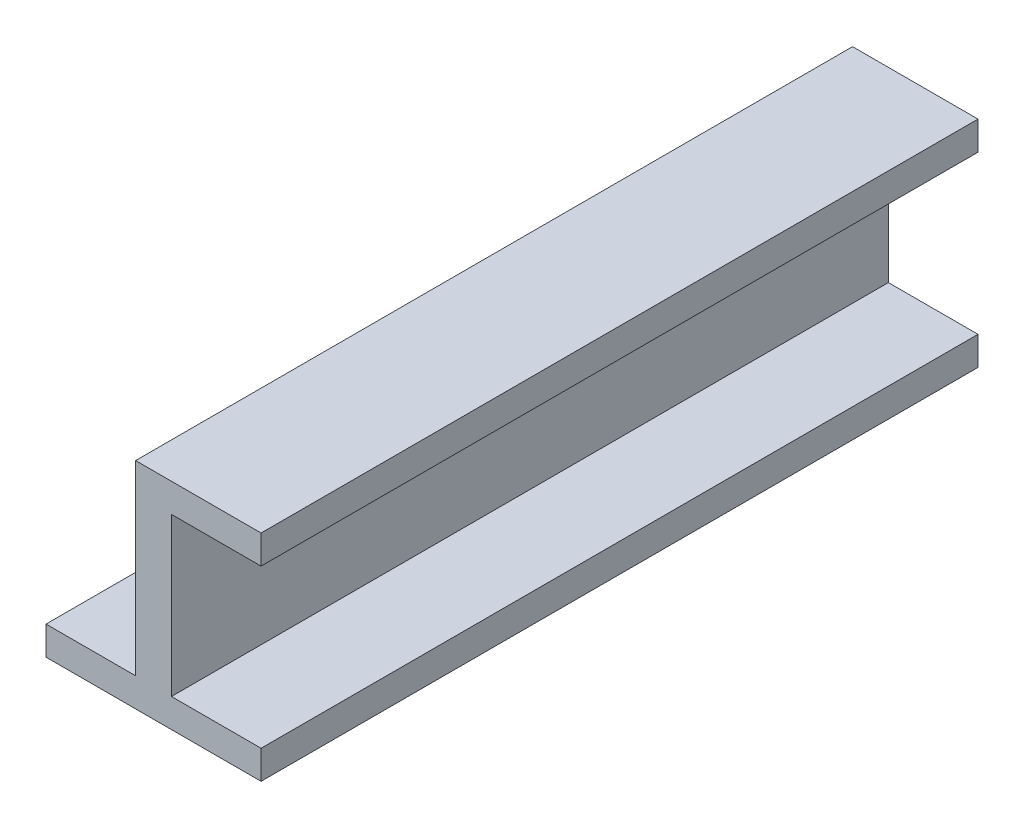
ISO-10303-21;
HEADER;
FILE_DESCRIPTION(('STEP AP214'),'2;1');
FILE_NAME('part.step','',(''),(''),'','','');
FILE_SCHEMA(('AUTOMOTIVE_DESIGN { 1 0 10303 214 1 1 1 1 }'));
ENDSEC;
DATA;
#1=APPLICATION_CONTEXT('core data for automotive mechanical design processes');
#2=APPLICATION_PROTOCOL_DEFINITION('international standard','automotive_design',2000,#1);
#3=PRODUCT_CONTEXT('',#1,'mechanical');
#4=PRODUCT('Part','Part','',(#3));
#5=PRODUCT_RELATED_PRODUCT_CATEGORY('part','',(#4));
#6=PRODUCT_DEFINITION_FORMATION('','',#4);
#7=PRODUCT_DEFINITION_CONTEXT('part definition',#1,'design');
#8=PRODUCT_DEFINITION('design','',#6,#7);
#9=PRODUCT_DEFINITION_SHAPE('','',#8);
#10=(LENGTH_UNIT() NAMED_UNIT(*) SI_UNIT(.MILLI.,.METRE.));
#11=(NAMED_UNIT(*) PLANE_ANGLE_UNIT() SI_UNIT($,.RADIAN.));
#12=(NAMED_UNIT(*) SI_UNIT($,.STERADIAN.) SOLID_ANGLE_UNIT());
#13=UNCERTAINTY_MEASURE_WITH_UNIT(LENGTH_MEASURE(1.E-05),#10,'distance_accuracy_value','');
#14=(GEOMETRIC_REPRESENTATION_CONTEXT(3) GLOBAL_UNCERTAINTY_ASSIGNED_CONTEXT((#13)) GLOBAL_UNIT_ASSIGNED_CONTEXT((#10,
#11,#12)) REPRESENTATION_CONTEXT('',''));
#15=CARTESIAN_POINT('',(0.,0.,0.));
#16=DIRECTION('',(0.,0.,1.));
#17=DIRECTION('',(1.,0.,0.));
#18=AXIS2_PLACEMENT_3D('',#15,#16,#17);
#19=CARTESIAN_POINT('',(-5.,0.,100.));
#20=DIRECTION('',(-1.,0.,0.));
#21=DIRECTION('',(0.,0.,1.));
#22=AXIS2_PLACEMENT_3D('',#19,#20,#21);
#23=PLANE('',#22);
#24=DIRECTION('',(0.,1.,0.));
#25=VECTOR('',#24,1.);
#26=CARTESIAN_POINT('',(-5.,0.,-100.));
#27=LINE('',#26,#25);
#28=CARTESIAN_POINT('',(-5.,-22.,-100.));
#29=VERTEX_POINT('',#28);
#30=CARTESIAN_POINT('',(-5.,30.,-100.));
#31=VERTEX_POINT('',#30);
#32=EDGE_CURVE('E140',#29,#31,#27,.T.);
#33=ORIENTED_EDGE('',*,*,#32,.F.);
#34=DIRECTION('',(0.,0.,-1.));
#35=VECTOR('',#34,1.);
#36=CARTESIAN_POINT('',(-5.,-22.,100.));
#37=LINE('',#36,#35);
#38=CARTESIAN_POINT('',(-5.,-22.,100.));
#39=VERTEX_POINT('',#38);
#40=EDGE_CURVE('E11',#39,#29,#37,.T.);
#41=ORIENTED_EDGE('',*,*,#40,.F.);
#42=DIRECTION('',(0.,1.,0.));
#43=VECTOR('',#42,1.);
#44=CARTESIAN_POINT('',(-5.,0.,100.));
#45=LINE('',#44,#43);
#46=CARTESIAN_POINT('',(-5.,30.,100.));
#47=VERTEX_POINT('',#46);
#48=EDGE_CURVE('E163',#39,#47,#45,.T.);
#49=ORIENTED_EDGE('',*,*,#48,.T.);
#50=DIRECTION('',(0.,0.,-1.));
#51=VECTOR('',#50,1.);
#52=CARTESIAN_POINT('',(-5.,30.,100.));
#53=LINE('',#52,#51);
#54=EDGE_CURVE('E51',#47,#31,#53,.T.);
#55=ORIENTED_EDGE('',*,*,#54,.T.);
#56=EDGE_LOOP('',(#33,#41,#49,#55));
#57=FACE_BOUND('',#56,.T.);
#58=ADVANCED_FACE('F35',(#57),#23,.T.);
#59=CARTESIAN_POINT('',(0.,-22.,100.));
#60=DIRECTION('',(0.,-1.,0.));
#61=DIRECTION('',(1.,0.,0.));
#62=AXIS2_PLACEMENT_3D('',#59,#60,#61);
#63=PLANE('',#62);
#64=DIRECTION('',(-1.,0.,0.));
#65=VECTOR('',#64,1.);
#66=CARTESIAN_POINT('',(0.,-22.,-100.));
#67=LINE('',#66,#65);
#68=CARTESIAN_POINT('',(-30.,-22.,-100.));
#69=VERTEX_POINT('',#68);
#70=EDGE_CURVE('E142',#29,#69,#67,.T.);
#71=ORIENTED_EDGE('',*,*,#70,.T.);
#72=DIRECTION('',(0.,0.,-1.));
#73=VECTOR('',#72,1.);
#74=CARTESIAN_POINT('',(-30.,-22.,100.));
#75=LINE('',#74,#73);
#76=CARTESIAN_POINT('',(-30.,-22.,100.));
#77=VERTEX_POINT('',#76);
#78=EDGE_CURVE('E43',#77,#69,#75,.T.);
#79=ORIENTED_EDGE('',*,*,#78,.F.);
#80=DIRECTION('',(-1.,0.,0.));
#81=VECTOR('',#80,1.);
#82=CARTESIAN_POINT('',(0.,-22.,100.));
#83=LINE('',#82,#81);
#84=EDGE_CURVE('E209',#39,#77,#83,.T.);
#85=ORIENTED_EDGE('',*,*,#84,.F.);
#86=ORIENTED_EDGE('',*,*,#40,.T.);
#87=EDGE_LOOP('',(#71,#79,#85,#86));
#88=FACE_BOUND('',#87,.T.);
#89=ADVANCED_FACE('F186',(#88),#63,.F.);
#90=CARTESIAN_POINT('',(-30.,0.,100.));
#91=DIRECTION('',(-1.,0.,0.));
#92=DIRECTION('',(0.,0.,1.));
#93=AXIS2_PLACEMENT_3D('',#90,#91,#92);
#94=PLANE('',#93);
#95=DIRECTION('',(0.,1.,0.));
#96=VECTOR('',#95,1.);
#97=CARTESIAN_POINT('',(-30.,0.,-100.));
#98=LINE('',#97,#96);
#99=CARTESIAN_POINT('',(-30.,-30.,-100.));
#100=VERTEX_POINT('',#99);
#101=EDGE_CURVE('E145',#100,#69,#98,.T.);
#102=ORIENTED_EDGE('',*,*,#101,.F.);
#103=DIRECTION('',(0.,0.,-1.));
#104=VECTOR('',#103,1.);
#105=CARTESIAN_POINT('',(-30.,-30.,100.));
#106=LINE('',#105,#104);
#107=CARTESIAN_POINT('',(-30.,-30.,100.));
#108=VERTEX_POINT('',#107);
#109=EDGE_CURVE('E176',#108,#100,#106,.T.);
#110=ORIENTED_EDGE('',*,*,#109,.F.);
#111=DIRECTION('',(0.,1.,0.));
#112=VECTOR('',#111,1.);
#113=CARTESIAN_POINT('',(-30.,0.,100.));
#114=LINE('',#113,#112);
#115=EDGE_CURVE('E183',#108,#77,#114,.T.);
#116=ORIENTED_EDGE('',*,*,#115,.T.);
#117=ORIENTED_EDGE('',*,*,#78,.T.);
#118=EDGE_LOOP('',(#102,#110,#116,#117));
#119=FACE_BOUND('',#118,.T.);
#120=ADVANCED_FACE('F181',(#119),#94,.T.);
#121=CARTESIAN_POINT('',(0.,-30.,100.));
#122=DIRECTION('',(0.,1.,0.));
#123=DIRECTION('',(-1.,0.,0.));
#124=AXIS2_PLACEMENT_3D('',#121,#122,#123);
#125=PLANE('',#124);
#126=DIRECTION('',(1.,0.,0.));
#127=VECTOR('',#126,1.);
#128=CARTESIAN_POINT('',(0.,-30.,-100.));
#129=LINE('',#128,#127);
#130=CARTESIAN_POINT('',(30.,-30.,-100.));
#131=VERTEX_POINT('',#130);
#132=EDGE_CURVE('E148',#100,#131,#129,.T.);
#133=ORIENTED_EDGE('',*,*,#132,.T.);
#134=DIRECTION('',(0.,0.,-1.));
#135=VECTOR('',#134,1.);
#136=CARTESIAN_POINT('',(30.,-30.,100.));
#137=LINE('',#136,#135);
#138=CARTESIAN_POINT('',(30.,-30.,100.));
#139=VERTEX_POINT('',#138);
#140=EDGE_CURVE('E173',#139,#131,#137,.T.);
#141=ORIENTED_EDGE('',*,*,#140,.F.);
#142=DIRECTION('',(1.,0.,0.));
#143=VECTOR('',#142,1.);
#144=CARTESIAN_POINT('',(0.,-30.,100.));
#145=LINE('',#144,#143);
#146=EDGE_CURVE('E203',#108,#139,#145,.T.);
#147=ORIENTED_EDGE('',*,*,#146,.F.);
#148=ORIENTED_EDGE('',*,*,#109,.T.);
#149=EDGE_LOOP('',(#133,#141,#147,#148));
#150=FACE_BOUND('',#149,.T.);
#151=ADVANCED_FACE('F194',(#150),#125,.F.);
#152=CARTESIAN_POINT('',(30.,0.,100.));
#153=DIRECTION('',(-1.,0.,0.));
#154=DIRECTION('',(0.,0.,1.));
#155=AXIS2_PLACEMENT_3D('',#152,#153,#154);
#156=PLANE('',#155);
#157=DIRECTION('',(0.,1.,0.));
#158=VECTOR('',#157,1.);
#159=CARTESIAN_POINT('',(30.,0.,-100.));
#160=LINE('',#159,#158);
#161=CARTESIAN_POINT('',(30.,-22.,-100.));
#162=VERTEX_POINT('',#161);
#163=EDGE_CURVE('E150',#131,#162,#160,.T.);
#164=ORIENTED_EDGE('',*,*,#163,.T.);
#165=DIRECTION('',(0.,0.,-1.));
#166=VECTOR('',#165,1.);
#167=CARTESIAN_POINT('',(30.,-22.,100.));
#168=LINE('',#167,#166);
#169=CARTESIAN_POINT('',(30.,-22.,100.));
#170=VERTEX_POINT('',#169);
#171=EDGE_CURVE('E170',#170,#162,#168,.T.);
#172=ORIENTED_EDGE('',*,*,#171,.F.);
#173=DIRECTION('',(0.,1.,0.));
#174=VECTOR('',#173,1.);
#175=CARTESIAN_POINT('',(30.,0.,100.));
#176=LINE('',#175,#174);
#177=EDGE_CURVE('E200',#139,#170,#176,.T.);
#178=ORIENTED_EDGE('',*,*,#177,.F.);
#179=ORIENTED_EDGE('',*,*,#140,.T.);
#180=EDGE_LOOP('',(#164,#172,#178,#179));
#181=FACE_BOUND('',#180,.T.);
#182=ADVANCED_FACE('F198',(#181),#156,.F.);
#183=CARTESIAN_POINT('',(0.,-22.,100.));
#184=DIRECTION('',(0.,-1.,0.));
#185=DIRECTION('',(1.,0.,0.));
#186=AXIS2_PLACEMENT_3D('',#183,#184,#185);
#187=PLANE('',#186);
#188=DIRECTION('',(-1.,0.,0.));
#189=VECTOR('',#188,1.);
#190=CARTESIAN_POINT('',(0.,-22.,-100.));
#191=LINE('',#190,#189);
#192=CARTESIAN_POINT('',(5.,-22.,-100.));
#193=VERTEX_POINT('',#192);
#194=EDGE_CURVE('E152',#162,#193,#191,.T.);
#195=ORIENTED_EDGE('',*,*,#194,.T.);
#196=DIRECTION('',(0.,0.,-1.));
#197=VECTOR('',#196,1.);
#198=CARTESIAN_POINT('',(5.,-22.,100.));
#199=LINE('',#198,#197);
#200=CARTESIAN_POINT('',(5.,-22.,100.));
#201=VERTEX_POINT('',#200);
#202=EDGE_CURVE('E167',#201,#193,#199,.T.);
#203=ORIENTED_EDGE('',*,*,#202,.F.);
#204=DIRECTION('',(-1.,0.,0.));
#205=VECTOR('',#204,1.);
#206=CARTESIAN_POINT('',(0.,-22.,100.));
#207=LINE('',#206,#205);
#208=EDGE_CURVE('E202',#170,#201,#207,.T.);
#209=ORIENTED_EDGE('',*,*,#208,.F.);
#210=ORIENTED_EDGE('',*,*,#171,.T.);
#211=EDGE_LOOP('',(#195,#203,#209,#210));
#212=FACE_BOUND('',#211,.T.);
#213=ADVANCED_FACE('F234',(#212),#187,.F.);
#214=CARTESIAN_POINT('',(5.,0.,100.));
#215=DIRECTION('',(-1.,0.,0.));
#216=DIRECTION('',(0.,0.,1.));
#217=AXIS2_PLACEMENT_3D('',#214,#215,#216);
#218=PLANE('',#217);
#219=DIRECTION('',(0.,1.,0.));
#220=VECTOR('',#219,1.);
#221=CARTESIAN_POINT('',(5.,0.,-100.));
#222=LINE('',#221,#220);
#223=CARTESIAN_POINT('',(5.,22.,-100.));
#224=VERTEX_POINT('',#223);
#225=EDGE_CURVE('E154',#193,#224,#222,.T.);
#226=ORIENTED_EDGE('',*,*,#225,.T.);
#227=DIRECTION('',(0.,0.,-1.));
#228=VECTOR('',#227,1.);
#229=CARTESIAN_POINT('',(5.,22.,100.));
#230=LINE('',#229,#228);
#231=CARTESIAN_POINT('',(5.,22.,100.));
#232=VERTEX_POINT('',#231);
#233=EDGE_CURVE('E122',#232,#224,#230,.T.);
#234=ORIENTED_EDGE('',*,*,#233,.F.);
#235=DIRECTION('',(0.,1.,0.));
#236=VECTOR('',#235,1.);
#237=CARTESIAN_POINT('',(5.,0.,100.));
#238=LINE('',#237,#236);
#239=EDGE_CURVE('E131',#201,#232,#238,.T.);
#240=ORIENTED_EDGE('',*,*,#239,.F.);
#241=ORIENTED_EDGE('',*,*,#202,.T.);
#242=EDGE_LOOP('',(#226,#234,#240,#241));
#243=FACE_BOUND('',#242,.T.);
#244=ADVANCED_FACE('F237',(#243),#218,.F.);
#245=CARTESIAN_POINT('',(0.,22.,100.));
#246=DIRECTION('',(0.,-1.,0.));
#247=DIRECTION('',(1.,0.,0.));
#248=AXIS2_PLACEMENT_3D('',#245,#246,#247);
#249=PLANE('',#248);
#250=DIRECTION('',(-1.,0.,0.));
#251=VECTOR('',#250,1.);
#252=CARTESIAN_POINT('',(0.,22.,-100.));
#253=LINE('',#252,#251);
#254=CARTESIAN_POINT('',(30.,22.,-100.));
#255=VERTEX_POINT('',#254);
#256=EDGE_CURVE('E118',#255,#224,#253,.T.);
#257=ORIENTED_EDGE('',*,*,#256,.F.);
#258=DIRECTION('',(0.,0.,-1.));
#259=VECTOR('',#258,1.);
#260=CARTESIAN_POINT('',(30.,22.,100.));
#261=LINE('',#260,#259);
#262=CARTESIAN_POINT('',(30.,22.,100.));
#263=VERTEX_POINT('',#262);
#264=EDGE_CURVE('E113',#263,#255,#261,.T.);
#265=ORIENTED_EDGE('',*,*,#264,.F.);
#266=DIRECTION('',(-1.,0.,0.));
#267=VECTOR('',#266,1.);
#268=CARTESIAN_POINT('',(0.,22.,100.));
#269=LINE('',#268,#267);
#270=EDGE_CURVE('E116',#263,#232,#269,.T.);
#271=ORIENTED_EDGE('',*,*,#270,.T.);
#272=ORIENTED_EDGE('',*,*,#233,.T.);
#273=EDGE_LOOP('',(#257,#265,#271,#272));
#274=FACE_BOUND('',#273,.T.);
#275=ADVANCED_FACE('F115',(#274),#249,.T.);
#276=CARTESIAN_POINT('',(30.,0.,100.));
#277=DIRECTION('',(1.,0.,0.));
#278=DIRECTION('',(0.,0.,-1.));
#279=AXIS2_PLACEMENT_3D('',#276,#277,#278);
#280=PLANE('',#279);
#281=DIRECTION('',(0.,-1.,0.));
#282=VECTOR('',#281,1.);
#283=CARTESIAN_POINT('',(30.,0.,-100.));
#284=LINE('',#283,#282);
#285=CARTESIAN_POINT('',(30.,30.,-100.));
#286=VERTEX_POINT('',#285);
#287=EDGE_CURVE('E158',#286,#255,#284,.T.);
#288=ORIENTED_EDGE('',*,*,#287,.F.);
#289=DIRECTION('',(0.,0.,-1.));
#290=VECTOR('',#289,1.);
#291=CARTESIAN_POINT('',(30.,30.,100.));
#292=LINE('',#291,#290);
#293=CARTESIAN_POINT('',(30.,30.,100.));
#294=VERTEX_POINT('',#293);
#295=EDGE_CURVE('E82',#294,#286,#292,.T.);
#296=ORIENTED_EDGE('',*,*,#295,.F.);
#297=DIRECTION('',(0.,-1.,0.));
#298=VECTOR('',#297,1.);
#299=CARTESIAN_POINT('',(30.,0.,100.));
#300=LINE('',#299,#298);
#301=EDGE_CURVE('E129',#294,#263,#300,.T.);
#302=ORIENTED_EDGE('',*,*,#301,.T.);
#303=ORIENTED_EDGE('',*,*,#264,.T.);
#304=EDGE_LOOP('',(#288,#296,#302,#303));
#305=FACE_BOUND('',#304,.T.);
#306=ADVANCED_FACE('F134',(#305),#280,.T.);
#307=CARTESIAN_POINT('',(0.,30.,100.));
#308=DIRECTION('',(0.,1.,0.));
#309=DIRECTION('',(0.,0.,1.));
#310=AXIS2_PLACEMENT_3D('',#307,#308,#309);
#311=PLANE('',#310);
#312=DIRECTION('',(1.,0.,0.));
#313=VECTOR('',#312,1.);
#314=CARTESIAN_POINT('',(0.,30.,-100.));
#315=LINE('',#314,#313);
#316=EDGE_CURVE('E160',#31,#286,#315,.T.);
#317=ORIENTED_EDGE('',*,*,#316,.F.);
#318=ORIENTED_EDGE('',*,*,#54,.F.);
#319=DIRECTION('',(1.,0.,0.));
#320=VECTOR('',#319,1.);
#321=CARTESIAN_POINT('',(0.,30.,100.));
#322=LINE('',#321,#320);
#323=EDGE_CURVE('E135',#47,#294,#322,.T.);
#324=ORIENTED_EDGE('',*,*,#323,.T.);
#325=ORIENTED_EDGE('',*,*,#295,.T.);
#326=EDGE_LOOP('',(#317,#318,#324,#325));
#327=FACE_BOUND('',#326,.T.);
#328=ADVANCED_FACE('F211',(#327),#311,.T.);
#329=CARTESIAN_POINT('',(0.,0.,100.));
#330=DIRECTION('',(0.,0.,1.));
#331=DIRECTION('',(1.,0.,0.));
#332=AXIS2_PLACEMENT_3D('',#329,#330,#331);
#333=PLANE('',#332);
#334=ORIENTED_EDGE('',*,*,#48,.F.);
#335=ORIENTED_EDGE('',*,*,#84,.T.);
#336=ORIENTED_EDGE('',*,*,#115,.F.);
#337=ORIENTED_EDGE('',*,*,#146,.T.);
#338=ORIENTED_EDGE('',*,*,#177,.T.);
#339=ORIENTED_EDGE('',*,*,#208,.T.);
#340=ORIENTED_EDGE('',*,*,#239,.T.);
#341=ORIENTED_EDGE('',*,*,#270,.F.);
#342=ORIENTED_EDGE('',*,*,#301,.F.);
#343=ORIENTED_EDGE('',*,*,#323,.F.);
#344=EDGE_LOOP('',(#334,#335,#336,#337,#338,#339,#340,#341,#342,#343));
#345=FACE_BOUND('',#344,.T.);
#346=ADVANCED_FACE('F127',(#345),#333,.T.);
#347=CARTESIAN_POINT('',(0.,0.,-100.));
#348=DIRECTION('',(0.,0.,1.));
#349=DIRECTION('',(1.,0.,0.));
#350=AXIS2_PLACEMENT_3D('',#347,#348,#349);
#351=PLANE('',#350);
#352=ORIENTED_EDGE('',*,*,#32,.T.);
#353=ORIENTED_EDGE('',*,*,#316,.T.);
#354=ORIENTED_EDGE('',*,*,#287,.T.);
#355=ORIENTED_EDGE('',*,*,#256,.T.);
#356=ORIENTED_EDGE('',*,*,#225,.F.);
#357=ORIENTED_EDGE('',*,*,#194,.F.);
#358=ORIENTED_EDGE('',*,*,#163,.F.);
#359=ORIENTED_EDGE('',*,*,#132,.F.);
#360=ORIENTED_EDGE('',*,*,#101,.T.);
#361=ORIENTED_EDGE('',*,*,#70,.F.);
#362=EDGE_LOOP('',(#352,#353,#354,#355,#356,#357,#358,#359,#360,#361));
#363=FACE_BOUND('',#362,.T.);
#364=ADVANCED_FACE('F189',(#363),#351,.F.);
#365=CLOSED_SHELL('',(#58,#89,#120,#151,#182,#213,#244,#275,#306,#328,#346,#364));
#366=MANIFOLD_SOLID_BREP('B2',#365);
#367=ADVANCED_BREP_SHAPE_REPRESENTATION('',(#18,#366),#14);
#368=SHAPE_DEFINITION_REPRESENTATION(#9,#367);
ENDSEC;
END-ISO-10303-21;
